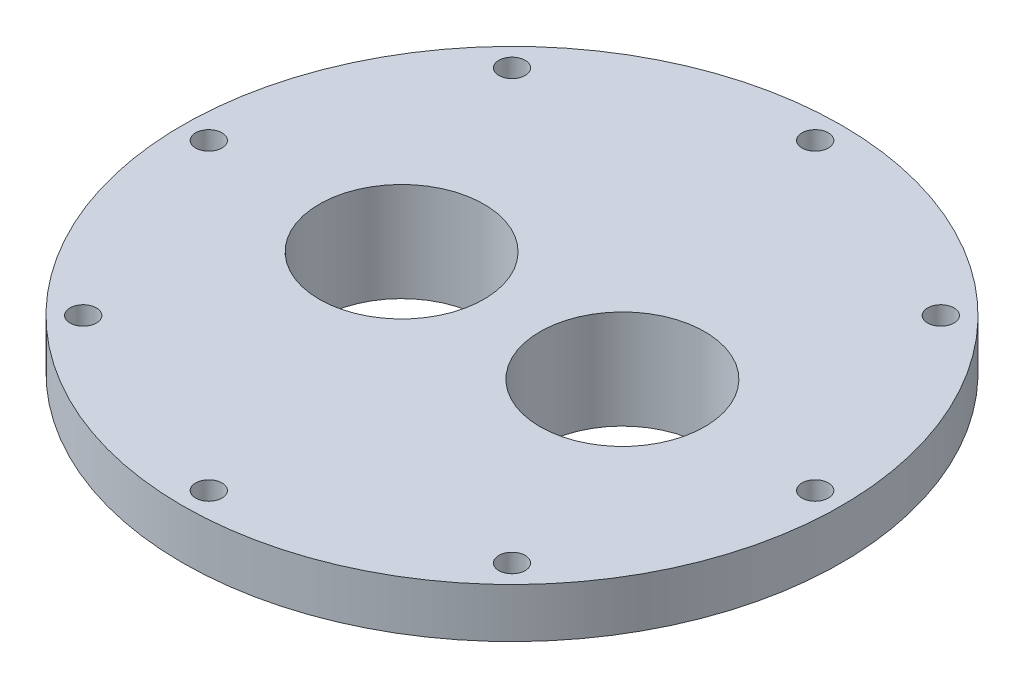
ISO-10303-21;
HEADER;
FILE_DESCRIPTION(('STEP AP214'),'2;1');
FILE_NAME('part.step','',(''),(''),'','','');
FILE_SCHEMA(('AUTOMOTIVE_DESIGN { 1 0 10303 214 1 1 1 1 }'));
ENDSEC;
DATA;
#1=APPLICATION_CONTEXT('core data for automotive mechanical design processes');
#2=APPLICATION_PROTOCOL_DEFINITION('international standard','automotive_design',2000,#1);
#3=PRODUCT_CONTEXT('',#1,'mechanical');
#4=PRODUCT('Part','Part','',(#3));
#5=PRODUCT_RELATED_PRODUCT_CATEGORY('part','',(#4));
#6=PRODUCT_DEFINITION_FORMATION('','',#4);
#7=PRODUCT_DEFINITION_CONTEXT('part definition',#1,'design');
#8=PRODUCT_DEFINITION('design','',#6,#7);
#9=PRODUCT_DEFINITION_SHAPE('','',#8);
#10=(LENGTH_UNIT() NAMED_UNIT(*) SI_UNIT(.MILLI.,.METRE.));
#11=(NAMED_UNIT(*) PLANE_ANGLE_UNIT() SI_UNIT($,.RADIAN.));
#12=(NAMED_UNIT(*) SI_UNIT($,.STERADIAN.) SOLID_ANGLE_UNIT());
#13=UNCERTAINTY_MEASURE_WITH_UNIT(LENGTH_MEASURE(1.E-05),#10,'distance_accuracy_value','');
#14=(GEOMETRIC_REPRESENTATION_CONTEXT(3) GLOBAL_UNCERTAINTY_ASSIGNED_CONTEXT((#13)) GLOBAL_UNIT_ASSIGNED_CONTEXT((#10,
#11,#12)) REPRESENTATION_CONTEXT('',''));
#15=CARTESIAN_POINT('',(0.,0.,0.));
#16=DIRECTION('',(0.,0.,1.));
#17=DIRECTION('',(1.,0.,0.));
#18=AXIS2_PLACEMENT_3D('',#15,#16,#17);
#19=CARTESIAN_POINT('',(-33.5,15.,0.));
#20=DIRECTION('',(0.,-1.,0.));
#21=DIRECTION('',(0.,0.,-1.));
#22=AXIS2_PLACEMENT_3D('',#19,#20,#21);
#23=CYLINDRICAL_SURFACE('',#22,25.);
#24=CARTESIAN_POINT('',(-33.5,0.,0.));
#25=DIRECTION('',(0.,1.,0.));
#26=DIRECTION('',(0.,0.,1.));
#27=AXIS2_PLACEMENT_3D('',#24,#25,#26);
#28=CIRCLE('',#27,25.);
#29=CARTESIAN_POINT('',(-33.5,0.,25.));
#30=VERTEX_POINT('',#29);
#31=EDGE_CURVE('E45',#30,#30,#28,.T.);
#32=ORIENTED_EDGE('',*,*,#31,.F.);
#33=EDGE_LOOP('',(#32));
#34=FACE_BOUND('',#33,.T.);
#35=CARTESIAN_POINT('',(-33.5,30.,0.));
#36=DIRECTION('',(0.,1.,0.));
#37=DIRECTION('',(0.,0.,1.));
#38=AXIS2_PLACEMENT_3D('',#35,#36,#37);
#39=CIRCLE('',#38,25.);
#40=CARTESIAN_POINT('',(-33.5,30.,25.));
#41=VERTEX_POINT('',#40);
#42=EDGE_CURVE('E63',#41,#41,#39,.F.);
#43=ORIENTED_EDGE('',*,*,#42,.F.);
#44=EDGE_LOOP('',(#43));
#45=FACE_BOUND('',#44,.T.);
#46=ADVANCED_FACE('F33',(#34,#45),#23,.F.);
#47=CARTESIAN_POINT('',(0.,15.,0.));
#48=DIRECTION('',(0.,-1.,0.));
#49=DIRECTION('',(0.,0.,-1.));
#50=AXIS2_PLACEMENT_3D('',#47,#48,#49);
#51=CYLINDRICAL_SURFACE('',#50,67.);
#52=CARTESIAN_POINT('',(0.,15.,0.));
#53=DIRECTION('',(0.,1.,0.));
#54=DIRECTION('',(0.,0.,1.));
#55=AXIS2_PLACEMENT_3D('',#52,#53,#54);
#56=CIRCLE('',#55,67.);
#57=CARTESIAN_POINT('',(0.,15.,67.));
#58=VERTEX_POINT('',#57);
#59=EDGE_CURVE('E10',#58,#58,#56,.T.);
#60=ORIENTED_EDGE('',*,*,#59,.F.);
#61=EDGE_LOOP('',(#60));
#62=FACE_BOUND('',#61,.T.);
#63=CARTESIAN_POINT('',(0.,0.,0.));
#64=DIRECTION('',(0.,1.,0.));
#65=DIRECTION('',(0.,0.,1.));
#66=AXIS2_PLACEMENT_3D('',#63,#64,#65);
#67=CIRCLE('',#66,67.);
#68=CARTESIAN_POINT('',(0.,0.,67.));
#69=VERTEX_POINT('',#68);
#70=EDGE_CURVE('E50',#69,#69,#67,.T.);
#71=ORIENTED_EDGE('',*,*,#70,.T.);
#72=EDGE_LOOP('',(#71));
#73=FACE_BOUND('',#72,.T.);
#74=ADVANCED_FACE('F35',(#62,#73),#51,.T.);
#75=CARTESIAN_POINT('',(33.5,15.,0.));
#76=DIRECTION('',(0.,-1.,0.));
#77=DIRECTION('',(0.,0.,-1.));
#78=AXIS2_PLACEMENT_3D('',#75,#76,#77);
#79=CYLINDRICAL_SURFACE('',#78,25.);
#80=CARTESIAN_POINT('',(33.5,0.,0.));
#81=DIRECTION('',(0.,1.,0.));
#82=DIRECTION('',(0.,0.,1.));
#83=AXIS2_PLACEMENT_3D('',#80,#81,#82);
#84=CIRCLE('',#83,25.);
#85=CARTESIAN_POINT('',(33.5,0.,25.));
#86=VERTEX_POINT('',#85);
#87=EDGE_CURVE('E37',#86,#86,#84,.F.);
#88=ORIENTED_EDGE('',*,*,#87,.T.);
#89=EDGE_LOOP('',(#88));
#90=FACE_BOUND('',#89,.T.);
#91=CARTESIAN_POINT('',(33.5,30.,0.));
#92=DIRECTION('',(0.,1.,0.));
#93=DIRECTION('',(0.,0.,1.));
#94=AXIS2_PLACEMENT_3D('',#91,#92,#93);
#95=CIRCLE('',#94,25.);
#96=CARTESIAN_POINT('',(33.5,30.,25.));
#97=VERTEX_POINT('',#96);
#98=EDGE_CURVE('E52',#97,#97,#95,.F.);
#99=ORIENTED_EDGE('',*,*,#98,.F.);
#100=EDGE_LOOP('',(#99));
#101=FACE_BOUND('',#100,.T.);
#102=ADVANCED_FACE('F154',(#90,#101),#79,.F.);
#103=CARTESIAN_POINT('',(0.,0.,0.));
#104=DIRECTION('',(0.,1.,0.));
#105=DIRECTION('',(0.,0.,1.));
#106=AXIS2_PLACEMENT_3D('',#103,#104,#105);
#107=PLANE('',#106);
#108=ORIENTED_EDGE('',*,*,#70,.F.);
#109=EDGE_LOOP('',(#108));
#110=FACE_BOUND('',#109,.T.);
#111=ORIENTED_EDGE('',*,*,#31,.T.);
#112=EDGE_LOOP('',(#111));
#113=FACE_BOUND('',#112,.T.);
#114=ORIENTED_EDGE('',*,*,#87,.F.);
#115=EDGE_LOOP('',(#114));
#116=FACE_BOUND('',#115,.T.);
#117=ADVANCED_FACE('F56',(#110,#113,#116),#107,.F.);
#118=CARTESIAN_POINT('',(0.,15.,0.));
#119=DIRECTION('',(0.,1.,0.));
#120=DIRECTION('',(0.,0.,1.));
#121=AXIS2_PLACEMENT_3D('',#118,#119,#120);
#122=PLANE('',#121);
#123=CARTESIAN_POINT('',(3.32483033725724E-13,15.,92.));
#124=DIRECTION('',(0.,1.,0.));
#125=DIRECTION('',(1.,0.,0.));
#126=AXIS2_PLACEMENT_3D('',#123,#124,#125);
#127=CIRCLE('',#126,4.00000000000001);
#128=CARTESIAN_POINT('',(4.00000000000034,15.,92.));
#129=VERTEX_POINT('',#128);
#130=EDGE_CURVE('E81',#129,#129,#127,.T.);
#131=ORIENTED_EDGE('',*,*,#130,.T.);
#132=EDGE_LOOP('',(#131));
#133=FACE_BOUND('',#132,.T.);
#134=CARTESIAN_POINT('',(65.0538238691627,15.,65.053823869162));
#135=DIRECTION('',(0.,1.,0.));
#136=DIRECTION('',(0.707106781186544,0.,-0.707106781186551));
#137=AXIS2_PLACEMENT_3D('',#134,#135,#136);
#138=CIRCLE('',#137,4.00000000000001);
#139=CARTESIAN_POINT('',(67.8822509939089,15.,62.2253967444158));
#140=VERTEX_POINT('',#139);
#141=EDGE_CURVE('E111',#140,#140,#138,.T.);
#142=ORIENTED_EDGE('',*,*,#141,.T.);
#143=EDGE_LOOP('',(#142));
#144=FACE_BOUND('',#143,.T.);
#145=CARTESIAN_POINT('',(92.,15.,0.));
#146=DIRECTION('',(0.,1.,0.));
#147=DIRECTION('',(0.,0.,-1.));
#148=AXIS2_PLACEMENT_3D('',#145,#146,#147);
#149=CIRCLE('',#148,4.00000000000001);
#150=CARTESIAN_POINT('',(92.,15.,-4.00000000000002));
#151=VERTEX_POINT('',#150);
#152=EDGE_CURVE('E105',#151,#151,#149,.T.);
#153=ORIENTED_EDGE('',*,*,#152,.T.);
#154=EDGE_LOOP('',(#153));
#155=FACE_BOUND('',#154,.T.);
#156=CARTESIAN_POINT('',(65.0538238691618,15.,-65.0538238691629));
#157=DIRECTION('',(0.,1.,0.));
#158=DIRECTION('',(-0.707106781186554,0.,-0.707106781186541));
#159=AXIS2_PLACEMENT_3D('',#156,#157,#158);
#160=CIRCLE('',#159,4.00000000000001);
#161=CARTESIAN_POINT('',(62.2253967444156,15.,-67.8822509939091));
#162=VERTEX_POINT('',#161);
#163=EDGE_CURVE('E99',#162,#162,#160,.T.);
#164=ORIENTED_EDGE('',*,*,#163,.T.);
#165=EDGE_LOOP('',(#164));
#166=FACE_BOUND('',#165,.T.);
#167=CARTESIAN_POINT('',(-9.7491560007286E-13,15.,-92.));
#168=DIRECTION('',(0.,1.,0.));
#169=DIRECTION('',(-1.,0.,0.));
#170=AXIS2_PLACEMENT_3D('',#167,#168,#169);
#171=CIRCLE('',#170,4.00000000000001);
#172=CARTESIAN_POINT('',(-4.00000000000098,15.,-92.));
#173=VERTEX_POINT('',#172);
#174=EDGE_CURVE('E93',#173,#173,#171,.T.);
#175=ORIENTED_EDGE('',*,*,#174,.T.);
#176=EDGE_LOOP('',(#175));
#177=FACE_BOUND('',#176,.T.);
#178=CARTESIAN_POINT('',(-65.0538238691632,15.,-65.0538238691616));
#179=DIRECTION('',(0.,1.,0.));
#180=DIRECTION('',(-0.707106781186539,0.,0.707106781186556));
#181=AXIS2_PLACEMENT_3D('',#178,#179,#180);
#182=CIRCLE('',#181,4.00000000000001);
#183=CARTESIAN_POINT('',(-67.8822509939094,15.,-62.2253967444153));
#184=VERTEX_POINT('',#183);
#185=EDGE_CURVE('E87',#184,#184,#182,.T.);
#186=ORIENTED_EDGE('',*,*,#185,.T.);
#187=EDGE_LOOP('',(#186));
#188=FACE_BOUND('',#187,.T.);
#189=CARTESIAN_POINT('',(-65.0538238691623,15.,65.0538238691625));
#190=DIRECTION('',(0.,1.,0.));
#191=DIRECTION('',(0.707106781186549,0.,0.707106781186546));
#192=AXIS2_PLACEMENT_3D('',#189,#190,#191);
#193=CIRCLE('',#192,4.00000000000001);
#194=CARTESIAN_POINT('',(-62.2253967444161,15.,67.8822509939087));
#195=VERTEX_POINT('',#194);
#196=EDGE_CURVE('E75',#195,#195,#193,.T.);
#197=ORIENTED_EDGE('',*,*,#196,.T.);
#198=EDGE_LOOP('',(#197));
#199=FACE_BOUND('',#198,.T.);
#200=CARTESIAN_POINT('',(-92.,15.,0.));
#201=DIRECTION('',(0.,1.,0.));
#202=DIRECTION('',(0.,0.,1.));
#203=AXIS2_PLACEMENT_3D('',#200,#201,#202);
#204=CIRCLE('',#203,4.00000000000001);
#205=CARTESIAN_POINT('',(-92.,15.,4.00000000000002));
#206=VERTEX_POINT('',#205);
#207=EDGE_CURVE('E74',#206,#206,#204,.T.);
#208=ORIENTED_EDGE('',*,*,#207,.T.);
#209=EDGE_LOOP('',(#208));
#210=FACE_BOUND('',#209,.T.);
#211=CARTESIAN_POINT('',(0.,15.,0.));
#212=DIRECTION('',(0.,1.,0.));
#213=DIRECTION('',(0.,0.,1.));
#214=AXIS2_PLACEMENT_3D('',#211,#212,#213);
#215=CIRCLE('',#214,100.);
#216=CARTESIAN_POINT('',(0.,15.,100.));
#217=VERTEX_POINT('',#216);
#218=EDGE_CURVE('E48',#217,#217,#215,.T.);
#219=ORIENTED_EDGE('',*,*,#218,.F.);
#220=EDGE_LOOP('',(#219));
#221=FACE_BOUND('',#220,.T.);
#222=ORIENTED_EDGE('',*,*,#59,.T.);
#223=EDGE_LOOP('',(#222));
#224=FACE_BOUND('',#223,.T.);
#225=ADVANCED_FACE('F120',(#133,#144,#155,#166,#177,#188,#199,#210,#221,#224),#122,.F.);
#226=CARTESIAN_POINT('',(0.,30.,0.));
#227=DIRECTION('',(0.,-1.,0.));
#228=DIRECTION('',(0.,0.,-1.));
#229=AXIS2_PLACEMENT_3D('',#226,#227,#228);
#230=CYLINDRICAL_SURFACE('',#229,100.);
#231=CARTESIAN_POINT('',(0.,30.,0.));
#232=DIRECTION('',(0.,1.,0.));
#233=DIRECTION('',(0.,0.,1.));
#234=AXIS2_PLACEMENT_3D('',#231,#232,#233);
#235=CIRCLE('',#234,100.);
#236=CARTESIAN_POINT('',(0.,30.,100.));
#237=VERTEX_POINT('',#236);
#238=EDGE_CURVE('E65',#237,#237,#235,.T.);
#239=ORIENTED_EDGE('',*,*,#238,.F.);
#240=EDGE_LOOP('',(#239));
#241=FACE_BOUND('',#240,.T.);
#242=ORIENTED_EDGE('',*,*,#218,.T.);
#243=EDGE_LOOP('',(#242));
#244=FACE_BOUND('',#243,.T.);
#245=ADVANCED_FACE('F134',(#241,#244),#230,.T.);
#246=CARTESIAN_POINT('',(0.,30.,0.));
#247=DIRECTION('',(0.,1.,0.));
#248=DIRECTION('',(0.,0.,1.));
#249=AXIS2_PLACEMENT_3D('',#246,#247,#248);
#250=PLANE('',#249);
#251=CARTESIAN_POINT('',(3.32483033725724E-13,30.,92.));
#252=DIRECTION('',(0.,1.,0.));
#253=DIRECTION('',(1.,0.,0.));
#254=AXIS2_PLACEMENT_3D('',#251,#252,#253);
#255=CIRCLE('',#254,4.00000000000001);
#256=CARTESIAN_POINT('',(4.00000000000034,30.,92.));
#257=VERTEX_POINT('',#256);
#258=EDGE_CURVE('E114',#257,#257,#255,.T.);
#259=ORIENTED_EDGE('',*,*,#258,.F.);
#260=EDGE_LOOP('',(#259));
#261=FACE_BOUND('',#260,.T.);
#262=CARTESIAN_POINT('',(65.0538238691627,30.,65.053823869162));
#263=DIRECTION('',(0.,1.,0.));
#264=DIRECTION('',(0.707106781186544,0.,-0.707106781186551));
#265=AXIS2_PLACEMENT_3D('',#262,#263,#264);
#266=CIRCLE('',#265,4.00000000000001);
#267=CARTESIAN_POINT('',(67.8822509939089,30.,62.2253967444158));
#268=VERTEX_POINT('',#267);
#269=EDGE_CURVE('E108',#268,#268,#266,.T.);
#270=ORIENTED_EDGE('',*,*,#269,.F.);
#271=EDGE_LOOP('',(#270));
#272=FACE_BOUND('',#271,.T.);
#273=CARTESIAN_POINT('',(92.,30.,0.));
#274=DIRECTION('',(0.,1.,0.));
#275=DIRECTION('',(0.,0.,-1.));
#276=AXIS2_PLACEMENT_3D('',#273,#274,#275);
#277=CIRCLE('',#276,4.00000000000001);
#278=CARTESIAN_POINT('',(92.,30.,-4.00000000000002));
#279=VERTEX_POINT('',#278);
#280=EDGE_CURVE('E102',#279,#279,#277,.T.);
#281=ORIENTED_EDGE('',*,*,#280,.F.);
#282=EDGE_LOOP('',(#281));
#283=FACE_BOUND('',#282,.T.);
#284=CARTESIAN_POINT('',(65.0538238691618,30.,-65.0538238691629));
#285=DIRECTION('',(0.,1.,0.));
#286=DIRECTION('',(-0.707106781186554,0.,-0.707106781186541));
#287=AXIS2_PLACEMENT_3D('',#284,#285,#286);
#288=CIRCLE('',#287,4.00000000000001);
#289=CARTESIAN_POINT('',(62.2253967444156,30.,-67.8822509939091));
#290=VERTEX_POINT('',#289);
#291=EDGE_CURVE('E96',#290,#290,#288,.T.);
#292=ORIENTED_EDGE('',*,*,#291,.F.);
#293=EDGE_LOOP('',(#292));
#294=FACE_BOUND('',#293,.T.);
#295=CARTESIAN_POINT('',(-9.7491560007286E-13,30.,-92.));
#296=DIRECTION('',(0.,1.,0.));
#297=DIRECTION('',(-1.,0.,0.));
#298=AXIS2_PLACEMENT_3D('',#295,#296,#297);
#299=CIRCLE('',#298,4.00000000000001);
#300=CARTESIAN_POINT('',(-4.00000000000098,30.,-92.));
#301=VERTEX_POINT('',#300);
#302=EDGE_CURVE('E90',#301,#301,#299,.T.);
#303=ORIENTED_EDGE('',*,*,#302,.F.);
#304=EDGE_LOOP('',(#303));
#305=FACE_BOUND('',#304,.T.);
#306=CARTESIAN_POINT('',(-65.0538238691632,30.,-65.0538238691616));
#307=DIRECTION('',(0.,1.,0.));
#308=DIRECTION('',(-0.707106781186539,0.,0.707106781186556));
#309=AXIS2_PLACEMENT_3D('',#306,#307,#308);
#310=CIRCLE('',#309,4.00000000000001);
#311=CARTESIAN_POINT('',(-67.8822509939094,30.,-62.2253967444153));
#312=VERTEX_POINT('',#311);
#313=EDGE_CURVE('E84',#312,#312,#310,.T.);
#314=ORIENTED_EDGE('',*,*,#313,.F.);
#315=EDGE_LOOP('',(#314));
#316=FACE_BOUND('',#315,.T.);
#317=CARTESIAN_POINT('',(-65.0538238691623,30.,65.0538238691625));
#318=DIRECTION('',(0.,1.,0.));
#319=DIRECTION('',(0.707106781186549,0.,0.707106781186546));
#320=AXIS2_PLACEMENT_3D('',#317,#318,#319);
#321=CIRCLE('',#320,4.00000000000001);
#322=CARTESIAN_POINT('',(-62.2253967444161,30.,67.8822509939087));
#323=VERTEX_POINT('',#322);
#324=EDGE_CURVE('E78',#323,#323,#321,.T.);
#325=ORIENTED_EDGE('',*,*,#324,.F.);
#326=EDGE_LOOP('',(#325));
#327=FACE_BOUND('',#326,.T.);
#328=CARTESIAN_POINT('',(-92.,30.,0.));
#329=DIRECTION('',(0.,1.,0.));
#330=DIRECTION('',(0.,0.,1.));
#331=AXIS2_PLACEMENT_3D('',#328,#329,#330);
#332=CIRCLE('',#331,4.00000000000001);
#333=CARTESIAN_POINT('',(-92.,30.,4.00000000000002));
#334=VERTEX_POINT('',#333);
#335=EDGE_CURVE('E71',#334,#334,#332,.T.);
#336=ORIENTED_EDGE('',*,*,#335,.F.);
#337=EDGE_LOOP('',(#336));
#338=FACE_BOUND('',#337,.T.);
#339=ORIENTED_EDGE('',*,*,#238,.T.);
#340=EDGE_LOOP('',(#339));
#341=FACE_BOUND('',#340,.T.);
#342=ORIENTED_EDGE('',*,*,#42,.T.);
#343=EDGE_LOOP('',(#342));
#344=FACE_BOUND('',#343,.T.);
#345=ORIENTED_EDGE('',*,*,#98,.T.);
#346=EDGE_LOOP('',(#345));
#347=FACE_BOUND('',#346,.T.);
#348=ADVANCED_FACE('F130',(#261,#272,#283,#294,#305,#316,#327,#338,#341,#344,#347),#250,.T.);
#349=CARTESIAN_POINT('',(-92.,15.,0.));
#350=DIRECTION('',(0.,1.,0.));
#351=DIRECTION('',(0.,0.,1.));
#352=AXIS2_PLACEMENT_3D('',#349,#350,#351);
#353=CYLINDRICAL_SURFACE('',#352,4.00000000000001);
#354=ORIENTED_EDGE('',*,*,#207,.F.);
#355=EDGE_LOOP('',(#354));
#356=FACE_BOUND('',#355,.T.);
#357=ORIENTED_EDGE('',*,*,#335,.T.);
#358=EDGE_LOOP('',(#357));
#359=FACE_BOUND('',#358,.T.);
#360=ADVANCED_FACE('F133',(#356,#359),#353,.F.);
#361=CARTESIAN_POINT('',(-65.0538238691623,15.,65.0538238691625));
#362=DIRECTION('',(0.,1.,0.));
#363=DIRECTION('',(0.,0.,1.));
#364=AXIS2_PLACEMENT_3D('',#361,#362,#363);
#365=CYLINDRICAL_SURFACE('',#364,4.00000000000001);
#366=ORIENTED_EDGE('',*,*,#196,.F.);
#367=EDGE_LOOP('',(#366));
#368=FACE_BOUND('',#367,.T.);
#369=ORIENTED_EDGE('',*,*,#324,.T.);
#370=EDGE_LOOP('',(#369));
#371=FACE_BOUND('',#370,.T.);
#372=ADVANCED_FACE('F173',(#368,#371),#365,.F.);
#373=CARTESIAN_POINT('',(-65.0538238691632,15.,-65.0538238691616));
#374=DIRECTION('',(0.,1.,0.));
#375=DIRECTION('',(0.,0.,1.));
#376=AXIS2_PLACEMENT_3D('',#373,#374,#375);
#377=CYLINDRICAL_SURFACE('',#376,4.00000000000001);
#378=ORIENTED_EDGE('',*,*,#185,.F.);
#379=EDGE_LOOP('',(#378));
#380=FACE_BOUND('',#379,.T.);
#381=ORIENTED_EDGE('',*,*,#313,.T.);
#382=EDGE_LOOP('',(#381));
#383=FACE_BOUND('',#382,.T.);
#384=ADVANCED_FACE('F177',(#380,#383),#377,.F.);
#385=CARTESIAN_POINT('',(-9.7491560007286E-13,15.,-92.));
#386=DIRECTION('',(0.,1.,0.));
#387=DIRECTION('',(0.,0.,1.));
#388=AXIS2_PLACEMENT_3D('',#385,#386,#387);
#389=CYLINDRICAL_SURFACE('',#388,4.00000000000001);
#390=ORIENTED_EDGE('',*,*,#174,.F.);
#391=EDGE_LOOP('',(#390));
#392=FACE_BOUND('',#391,.T.);
#393=ORIENTED_EDGE('',*,*,#302,.T.);
#394=EDGE_LOOP('',(#393));
#395=FACE_BOUND('',#394,.T.);
#396=ADVANCED_FACE('F181',(#392,#395),#389,.F.);
#397=CARTESIAN_POINT('',(65.0538238691618,15.,-65.0538238691629));
#398=DIRECTION('',(0.,1.,0.));
#399=DIRECTION('',(0.,0.,1.));
#400=AXIS2_PLACEMENT_3D('',#397,#398,#399);
#401=CYLINDRICAL_SURFACE('',#400,4.00000000000001);
#402=ORIENTED_EDGE('',*,*,#163,.F.);
#403=EDGE_LOOP('',(#402));
#404=FACE_BOUND('',#403,.T.);
#405=ORIENTED_EDGE('',*,*,#291,.T.);
#406=EDGE_LOOP('',(#405));
#407=FACE_BOUND('',#406,.T.);
#408=ADVANCED_FACE('F185',(#404,#407),#401,.F.);
#409=CARTESIAN_POINT('',(92.,15.,0.));
#410=DIRECTION('',(0.,1.,0.));
#411=DIRECTION('',(0.,0.,1.));
#412=AXIS2_PLACEMENT_3D('',#409,#410,#411);
#413=CYLINDRICAL_SURFACE('',#412,4.00000000000001);
#414=ORIENTED_EDGE('',*,*,#152,.F.);
#415=EDGE_LOOP('',(#414));
#416=FACE_BOUND('',#415,.T.);
#417=ORIENTED_EDGE('',*,*,#280,.T.);
#418=EDGE_LOOP('',(#417));
#419=FACE_BOUND('',#418,.T.);
#420=ADVANCED_FACE('F189',(#416,#419),#413,.F.);
#421=CARTESIAN_POINT('',(65.0538238691627,15.,65.053823869162));
#422=DIRECTION('',(0.,1.,0.));
#423=DIRECTION('',(0.,0.,1.));
#424=AXIS2_PLACEMENT_3D('',#421,#422,#423);
#425=CYLINDRICAL_SURFACE('',#424,4.00000000000001);
#426=ORIENTED_EDGE('',*,*,#141,.F.);
#427=EDGE_LOOP('',(#426));
#428=FACE_BOUND('',#427,.T.);
#429=ORIENTED_EDGE('',*,*,#269,.T.);
#430=EDGE_LOOP('',(#429));
#431=FACE_BOUND('',#430,.T.);
#432=ADVANCED_FACE('F126',(#428,#431),#425,.F.);
#433=CARTESIAN_POINT('',(3.32483033725724E-13,15.,92.));
#434=DIRECTION('',(0.,1.,0.));
#435=DIRECTION('',(0.,0.,1.));
#436=AXIS2_PLACEMENT_3D('',#433,#434,#435);
#437=CYLINDRICAL_SURFACE('',#436,4.00000000000001);
#438=ORIENTED_EDGE('',*,*,#130,.F.);
#439=EDGE_LOOP('',(#438));
#440=FACE_BOUND('',#439,.T.);
#441=ORIENTED_EDGE('',*,*,#258,.T.);
#442=EDGE_LOOP('',(#441));
#443=FACE_BOUND('',#442,.T.);
#444=ADVANCED_FACE('F123',(#440,#443),#437,.F.);
#445=CLOSED_SHELL('',(#46,#74,#102,#117,#225,#245,#348,#360,#372,#384,#396,#408,#420,#432,#444));
#446=MANIFOLD_SOLID_BREP('B2',#445);
#447=ADVANCED_BREP_SHAPE_REPRESENTATION('',(#18,#446),#14);
#448=SHAPE_DEFINITION_REPRESENTATION(#9,#447);
ENDSEC;
END-ISO-10303-21;
